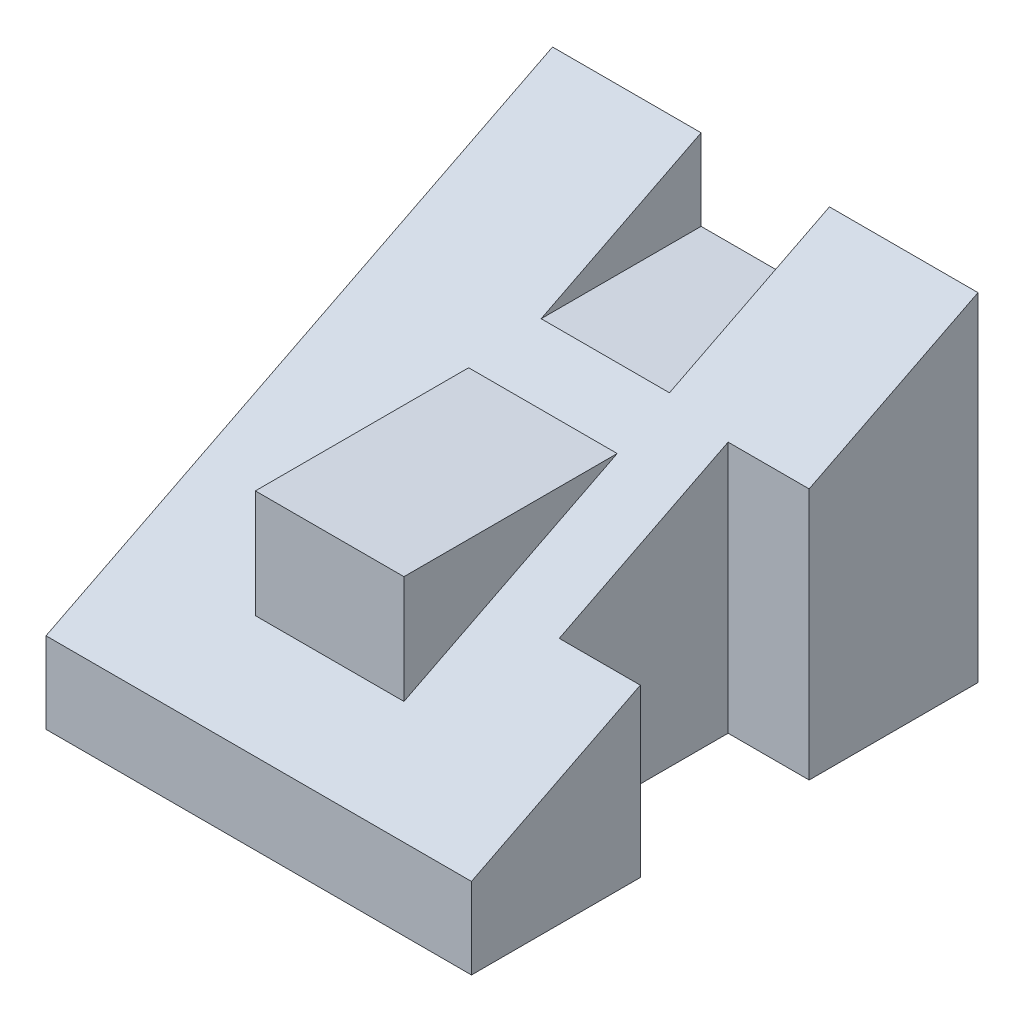
ISO-10303-21;
HEADER;
FILE_DESCRIPTION(('STEP AP214'),'2;1');
FILE_NAME('part.step','',(''),(''),'','','');
FILE_SCHEMA(('AUTOMOTIVE_DESIGN { 1 0 10303 214 1 1 1 1 }'));
ENDSEC;
DATA;
#1=APPLICATION_CONTEXT('core data for automotive mechanical design processes');
#2=APPLICATION_PROTOCOL_DEFINITION('international standard','automotive_design',2000,#1);
#3=PRODUCT_CONTEXT('',#1,'mechanical');
#4=PRODUCT('Part','Part','',(#3));
#5=PRODUCT_RELATED_PRODUCT_CATEGORY('part','',(#4));
#6=PRODUCT_DEFINITION_FORMATION('','',#4);
#7=PRODUCT_DEFINITION_CONTEXT('part definition',#1,'design');
#8=PRODUCT_DEFINITION('design','',#6,#7);
#9=PRODUCT_DEFINITION_SHAPE('','',#8);
#10=(LENGTH_UNIT() NAMED_UNIT(*) SI_UNIT(.MILLI.,.METRE.));
#11=(NAMED_UNIT(*) PLANE_ANGLE_UNIT() SI_UNIT($,.RADIAN.));
#12=(NAMED_UNIT(*) SI_UNIT($,.STERADIAN.) SOLID_ANGLE_UNIT());
#13=UNCERTAINTY_MEASURE_WITH_UNIT(LENGTH_MEASURE(1.E-05),#10,'distance_accuracy_value','');
#14=(GEOMETRIC_REPRESENTATION_CONTEXT(3) GLOBAL_UNCERTAINTY_ASSIGNED_CONTEXT((#13)) GLOBAL_UNIT_ASSIGNED_CONTEXT((#10,
#11,#12)) REPRESENTATION_CONTEXT('',''));
#15=CARTESIAN_POINT('',(0.,0.,0.));
#16=DIRECTION('',(0.,0.,1.));
#17=DIRECTION('',(1.,0.,0.));
#18=AXIS2_PLACEMENT_3D('',#15,#16,#17);
#19=CARTESIAN_POINT('',(63.,39.7863912858962,20.1584382515207));
#20=DIRECTION('',(0.,-0.892035776030268,-0.451964793188669));
#21=DIRECTION('',(0.,0.45196479318867,-0.892035776030269));
#22=AXIS2_PLACEMENT_3D('',#19,#20,#21);
#23=PLANE('',#22);
#24=DIRECTION('',(0.,-0.45196479318867,0.892035776030269));
#25=VECTOR('',#24,1.);
#26=CARTESIAN_POINT('',(0.,39.7863912858962,20.1584382515207));
#27=LINE('',#26,#25);
#28=CARTESIAN_POINT('',(0.,50.,0.));
#29=VERTEX_POINT('',#28);
#30=CARTESIAN_POINT('',(0.,12.,75.));
#31=VERTEX_POINT('',#30);
#32=EDGE_CURVE('E255',#29,#31,#27,.T.);
#33=ORIENTED_EDGE('',*,*,#32,.T.);
#34=DIRECTION('',(-1.,0.,0.));
#35=VECTOR('',#34,1.);
#36=CARTESIAN_POINT('',(63.,12.,75.));
#37=LINE('',#36,#35);
#38=CARTESIAN_POINT('',(63.,12.,75.));
#39=VERTEX_POINT('',#38);
#40=EDGE_CURVE('E54',#39,#31,#37,.T.);
#41=ORIENTED_EDGE('',*,*,#40,.F.);
#42=DIRECTION('',(0.,-0.45196479318867,0.892035776030269));
#43=VECTOR('',#42,1.);
#44=CARTESIAN_POINT('',(63.,39.7863912858962,20.1584382515207));
#45=LINE('',#44,#43);
#46=CARTESIAN_POINT('',(63.,24.6666666666667,50.));
#47=VERTEX_POINT('',#46);
#48=EDGE_CURVE('E260',#47,#39,#45,.T.);
#49=ORIENTED_EDGE('',*,*,#48,.F.);
#50=DIRECTION('',(-1.,0.,0.));
#51=VECTOR('',#50,1.);
#52=CARTESIAN_POINT('',(63.,24.6666666666667,50.));
#53=LINE('',#52,#51);
#54=CARTESIAN_POINT('',(51.,24.6666666666667,50.));
#55=VERTEX_POINT('',#54);
#56=EDGE_CURVE('E11',#47,#55,#53,.T.);
#57=ORIENTED_EDGE('',*,*,#56,.T.);
#58=DIRECTION('',(0.,-0.45196479318867,0.892035776030269));
#59=VECTOR('',#58,1.);
#60=CARTESIAN_POINT('',(51.,39.7863912858962,20.1584382515207));
#61=LINE('',#60,#59);
#62=CARTESIAN_POINT('',(51.,37.3333333333333,25.));
#63=VERTEX_POINT('',#62);
#64=EDGE_CURVE('E240',#63,#55,#61,.T.);
#65=ORIENTED_EDGE('',*,*,#64,.F.);
#66=DIRECTION('',(-1.,0.,0.));
#67=VECTOR('',#66,1.);
#68=CARTESIAN_POINT('',(63.,37.3333333333333,25.));
#69=LINE('',#68,#67);
#70=CARTESIAN_POINT('',(63.,37.3333333333333,25.));
#71=VERTEX_POINT('',#70);
#72=EDGE_CURVE('E234',#71,#63,#69,.T.);
#73=ORIENTED_EDGE('',*,*,#72,.F.);
#74=DIRECTION('',(0.,-0.45196479318867,0.892035776030269));
#75=VECTOR('',#74,1.);
#76=CARTESIAN_POINT('',(63.,39.7863912858962,20.1584382515207));
#77=LINE('',#76,#75);
#78=CARTESIAN_POINT('',(63.,50.,0.));
#79=VERTEX_POINT('',#78);
#80=EDGE_CURVE('E207',#79,#71,#77,.T.);
#81=ORIENTED_EDGE('',*,*,#80,.F.);
#82=DIRECTION('',(-1.,0.,0.));
#83=VECTOR('',#82,1.);
#84=CARTESIAN_POINT('',(63.,50.,0.));
#85=LINE('',#84,#83);
#86=CARTESIAN_POINT('',(41.,50.,0.));
#87=VERTEX_POINT('',#86);
#88=EDGE_CURVE('E187',#79,#87,#85,.T.);
#89=ORIENTED_EDGE('',*,*,#88,.T.);
#90=DIRECTION('',(0.,-0.45196479318867,0.892035776030269));
#91=VECTOR('',#90,1.);
#92=CARTESIAN_POINT('',(41.,39.7863912858962,20.1584382515207));
#93=LINE('',#92,#91);
#94=CARTESIAN_POINT('',(41.,38.,23.6842105263158));
#95=VERTEX_POINT('',#94);
#96=EDGE_CURVE('E171',#87,#95,#93,.T.);
#97=ORIENTED_EDGE('',*,*,#96,.T.);
#98=DIRECTION('',(-1.,0.,0.));
#99=VECTOR('',#98,1.);
#100=CARTESIAN_POINT('',(63.,38.,23.6842105263158));
#101=LINE('',#100,#99);
#102=CARTESIAN_POINT('',(22.,38.,23.6842105263158));
#103=VERTEX_POINT('',#102);
#104=EDGE_CURVE('E69',#95,#103,#101,.T.);
#105=ORIENTED_EDGE('',*,*,#104,.T.);
#106=DIRECTION('',(0.,-0.45196479318867,0.892035776030269));
#107=VECTOR('',#106,1.);
#108=CARTESIAN_POINT('',(22.,39.7863912858962,20.1584382515207));
#109=LINE('',#108,#107);
#110=CARTESIAN_POINT('',(22.,50.,0.));
#111=VERTEX_POINT('',#110);
#112=EDGE_CURVE('E191',#111,#103,#109,.T.);
#113=ORIENTED_EDGE('',*,*,#112,.F.);
#114=DIRECTION('',(-1.,0.,0.));
#115=VECTOR('',#114,1.);
#116=CARTESIAN_POINT('',(22.,50.,0.));
#117=LINE('',#116,#115);
#118=EDGE_CURVE('E202',#111,#29,#117,.T.);
#119=ORIENTED_EDGE('',*,*,#118,.T.);
#120=EDGE_LOOP('',(#33,#41,#49,#57,#65,#73,#81,#89,#97,#105,#113,#119));
#121=FACE_BOUND('',#120,.T.);
#122=DIRECTION('',(0.,-0.45196479318867,0.892035776030269));
#123=VECTOR('',#122,1.);
#124=CARTESIAN_POINT('',(19.,39.7863912858962,20.1584382515207));
#125=LINE('',#124,#123);
#126=CARTESIAN_POINT('',(19.,34.08,31.421052631579));
#127=VERTEX_POINT('',#126);
#128=CARTESIAN_POINT('',(19.,18.08,63.));
#129=VERTEX_POINT('',#128);
#130=EDGE_CURVE('E61',#127,#129,#125,.T.);
#131=ORIENTED_EDGE('',*,*,#130,.F.);
#132=DIRECTION('',(-1.,0.,0.));
#133=VECTOR('',#132,1.);
#134=CARTESIAN_POINT('',(41.,34.08,31.421052631579));
#135=LINE('',#134,#133);
#136=CARTESIAN_POINT('',(41.,34.08,31.421052631579));
#137=VERTEX_POINT('',#136);
#138=EDGE_CURVE('E178',#137,#127,#135,.T.);
#139=ORIENTED_EDGE('',*,*,#138,.F.);
#140=DIRECTION('',(0.,-0.45196479318867,0.892035776030269));
#141=VECTOR('',#140,1.);
#142=CARTESIAN_POINT('',(41.,39.7863912858962,20.1584382515207));
#143=LINE('',#142,#141);
#144=CARTESIAN_POINT('',(41.,18.08,63.));
#145=VERTEX_POINT('',#144);
#146=EDGE_CURVE('E160',#137,#145,#143,.T.);
#147=ORIENTED_EDGE('',*,*,#146,.T.);
#148=DIRECTION('',(-1.,0.,0.));
#149=VECTOR('',#148,1.);
#150=CARTESIAN_POINT('',(41.,18.08,63.));
#151=LINE('',#150,#149);
#152=EDGE_CURVE('E155',#145,#129,#151,.T.);
#153=ORIENTED_EDGE('',*,*,#152,.T.);
#154=EDGE_LOOP('',(#131,#139,#147,#153));
#155=FACE_BOUND('',#154,.T.);
#156=ADVANCED_FACE('F45',(#121,#155),#23,.F.);
#157=CARTESIAN_POINT('',(63.,38.,0.));
#158=DIRECTION('',(0.,1.,0.));
#159=DIRECTION('',(0.,0.,1.));
#160=AXIS2_PLACEMENT_3D('',#157,#158,#159);
#161=PLANE('',#160);
#162=ORIENTED_EDGE('',*,*,#104,.F.);
#163=DIRECTION('',(0.,0.,-1.));
#164=VECTOR('',#163,1.);
#165=CARTESIAN_POINT('',(41.,38.,0.));
#166=LINE('',#165,#164);
#167=CARTESIAN_POINT('',(41.,38.,0.));
#168=VERTEX_POINT('',#167);
#169=EDGE_CURVE('E176',#95,#168,#166,.T.);
#170=ORIENTED_EDGE('',*,*,#169,.T.);
#171=DIRECTION('',(-1.,0.,0.));
#172=VECTOR('',#171,1.);
#173=CARTESIAN_POINT('',(63.,38.,0.));
#174=LINE('',#173,#172);
#175=CARTESIAN_POINT('',(22.,38.,0.));
#176=VERTEX_POINT('',#175);
#177=EDGE_CURVE('E220',#168,#176,#174,.T.);
#178=ORIENTED_EDGE('',*,*,#177,.T.);
#179=DIRECTION('',(0.,0.,-1.));
#180=VECTOR('',#179,1.);
#181=CARTESIAN_POINT('',(22.,38.,0.));
#182=LINE('',#181,#180);
#183=EDGE_CURVE('E195',#103,#176,#182,.T.);
#184=ORIENTED_EDGE('',*,*,#183,.F.);
#185=EDGE_LOOP('',(#162,#170,#178,#184));
#186=FACE_BOUND('',#185,.T.);
#187=ADVANCED_FACE('F336',(#186),#161,.T.);
#188=CARTESIAN_POINT('',(63.,0.,50.));
#189=DIRECTION('',(0.,0.,-1.));
#190=DIRECTION('',(0.,1.,0.));
#191=AXIS2_PLACEMENT_3D('',#188,#189,#190);
#192=PLANE('',#191);
#193=DIRECTION('',(0.,-1.,0.));
#194=VECTOR('',#193,1.);
#195=CARTESIAN_POINT('',(51.,0.,50.));
#196=LINE('',#195,#194);
#197=CARTESIAN_POINT('',(51.,0.,50.));
#198=VERTEX_POINT('',#197);
#199=EDGE_CURVE('E244',#55,#198,#196,.T.);
#200=ORIENTED_EDGE('',*,*,#199,.F.);
#201=ORIENTED_EDGE('',*,*,#56,.F.);
#202=DIRECTION('',(0.,-1.,0.));
#203=VECTOR('',#202,1.);
#204=CARTESIAN_POINT('',(63.,0.,50.));
#205=LINE('',#204,#203);
#206=CARTESIAN_POINT('',(63.,0.,50.));
#207=VERTEX_POINT('',#206);
#208=EDGE_CURVE('E256',#47,#207,#205,.T.);
#209=ORIENTED_EDGE('',*,*,#208,.T.);
#210=DIRECTION('',(-1.,0.,0.));
#211=VECTOR('',#210,1.);
#212=CARTESIAN_POINT('',(63.,0.,50.));
#213=LINE('',#212,#211);
#214=EDGE_CURVE('E270',#207,#198,#213,.T.);
#215=ORIENTED_EDGE('',*,*,#214,.T.);
#216=EDGE_LOOP('',(#200,#201,#209,#215));
#217=FACE_BOUND('',#216,.T.);
#218=ADVANCED_FACE('F47',(#217),#192,.T.);
#219=CARTESIAN_POINT('',(63.,0.,75.));
#220=DIRECTION('',(0.,0.,-1.));
#221=DIRECTION('',(-1.,0.,0.));
#222=AXIS2_PLACEMENT_3D('',#219,#220,#221);
#223=PLANE('',#222);
#224=DIRECTION('',(0.,-1.,0.));
#225=VECTOR('',#224,1.);
#226=CARTESIAN_POINT('',(0.,0.,75.));
#227=LINE('',#226,#225);
#228=CARTESIAN_POINT('',(0.,0.,75.));
#229=VERTEX_POINT('',#228);
#230=EDGE_CURVE('E273',#31,#229,#227,.T.);
#231=ORIENTED_EDGE('',*,*,#230,.T.);
#232=DIRECTION('',(-1.,0.,0.));
#233=VECTOR('',#232,1.);
#234=CARTESIAN_POINT('',(63.,0.,75.));
#235=LINE('',#234,#233);
#236=CARTESIAN_POINT('',(63.,0.,75.));
#237=VERTEX_POINT('',#236);
#238=EDGE_CURVE('E280',#237,#229,#235,.T.);
#239=ORIENTED_EDGE('',*,*,#238,.F.);
#240=DIRECTION('',(0.,-1.,0.));
#241=VECTOR('',#240,1.);
#242=CARTESIAN_POINT('',(63.,0.,75.));
#243=LINE('',#242,#241);
#244=EDGE_CURVE('E264',#39,#237,#243,.T.);
#245=ORIENTED_EDGE('',*,*,#244,.F.);
#246=ORIENTED_EDGE('',*,*,#40,.T.);
#247=EDGE_LOOP('',(#231,#239,#245,#246));
#248=FACE_BOUND('',#247,.T.);
#249=ADVANCED_FACE('F289',(#248),#223,.F.);
#250=CARTESIAN_POINT('',(63.,0.,0.));
#251=DIRECTION('',(0.,1.,0.));
#252=DIRECTION('',(0.,0.,1.));
#253=AXIS2_PLACEMENT_3D('',#250,#251,#252);
#254=PLANE('',#253);
#255=DIRECTION('',(0.,0.,-1.));
#256=VECTOR('',#255,1.);
#257=CARTESIAN_POINT('',(0.,0.,0.));
#258=LINE('',#257,#256);
#259=CARTESIAN_POINT('',(0.,0.,0.));
#260=VERTEX_POINT('',#259);
#261=EDGE_CURVE('E261',#229,#260,#258,.T.);
#262=ORIENTED_EDGE('',*,*,#261,.T.);
#263=DIRECTION('',(-1.,0.,0.));
#264=VECTOR('',#263,1.);
#265=CARTESIAN_POINT('',(63.,0.,0.));
#266=LINE('',#265,#264);
#267=CARTESIAN_POINT('',(63.,0.,0.));
#268=VERTEX_POINT('',#267);
#269=EDGE_CURVE('E226',#268,#260,#266,.T.);
#270=ORIENTED_EDGE('',*,*,#269,.F.);
#271=DIRECTION('',(0.,0.,-1.));
#272=VECTOR('',#271,1.);
#273=CARTESIAN_POINT('',(63.,0.,0.));
#274=LINE('',#273,#272);
#275=CARTESIAN_POINT('',(63.,0.,25.));
#276=VERTEX_POINT('',#275);
#277=EDGE_CURVE('E213',#276,#268,#274,.T.);
#278=ORIENTED_EDGE('',*,*,#277,.F.);
#279=DIRECTION('',(-1.,0.,0.));
#280=VECTOR('',#279,1.);
#281=CARTESIAN_POINT('',(63.,0.,25.));
#282=LINE('',#281,#280);
#283=CARTESIAN_POINT('',(51.,0.,25.));
#284=VERTEX_POINT('',#283);
#285=EDGE_CURVE('E230',#276,#284,#282,.T.);
#286=ORIENTED_EDGE('',*,*,#285,.T.);
#287=DIRECTION('',(0.,0.,-1.));
#288=VECTOR('',#287,1.);
#289=CARTESIAN_POINT('',(51.,0.,0.));
#290=LINE('',#289,#288);
#291=EDGE_CURVE('E248',#198,#284,#290,.T.);
#292=ORIENTED_EDGE('',*,*,#291,.F.);
#293=ORIENTED_EDGE('',*,*,#214,.F.);
#294=DIRECTION('',(0.,0.,-1.));
#295=VECTOR('',#294,1.);
#296=CARTESIAN_POINT('',(63.,0.,0.));
#297=LINE('',#296,#295);
#298=EDGE_CURVE('E267',#237,#207,#297,.T.);
#299=ORIENTED_EDGE('',*,*,#298,.F.);
#300=ORIENTED_EDGE('',*,*,#238,.T.);
#301=EDGE_LOOP('',(#262,#270,#278,#286,#292,#293,#299,#300));
#302=FACE_BOUND('',#301,.T.);
#303=ADVANCED_FACE('F299',(#302),#254,.F.);
#304=CARTESIAN_POINT('',(63.,0.,0.));
#305=DIRECTION('',(1.,0.,0.));
#306=DIRECTION('',(0.,0.,-1.));
#307=AXIS2_PLACEMENT_3D('',#304,#305,#306);
#308=PLANE('',#307);
#309=ORIENTED_EDGE('',*,*,#208,.F.);
#310=ORIENTED_EDGE('',*,*,#48,.T.);
#311=ORIENTED_EDGE('',*,*,#244,.T.);
#312=ORIENTED_EDGE('',*,*,#298,.T.);
#313=EDGE_LOOP('',(#309,#310,#311,#312));
#314=FACE_BOUND('',#313,.T.);
#315=ADVANCED_FACE('F323',(#314),#308,.T.);
#316=CARTESIAN_POINT('',(0.,0.,0.));
#317=DIRECTION('',(1.,0.,0.));
#318=DIRECTION('',(0.,0.,-1.));
#319=AXIS2_PLACEMENT_3D('',#316,#317,#318);
#320=PLANE('',#319);
#321=ORIENTED_EDGE('',*,*,#32,.F.);
#322=DIRECTION('',(0.,1.,0.));
#323=VECTOR('',#322,1.);
#324=CARTESIAN_POINT('',(0.,0.,0.));
#325=LINE('',#324,#323);
#326=EDGE_CURVE('E206',#260,#29,#325,.T.);
#327=ORIENTED_EDGE('',*,*,#326,.F.);
#328=ORIENTED_EDGE('',*,*,#261,.F.);
#329=ORIENTED_EDGE('',*,*,#230,.F.);
#330=EDGE_LOOP('',(#321,#327,#328,#329));
#331=FACE_BOUND('',#330,.T.);
#332=ADVANCED_FACE('F295',(#331),#320,.F.);
#333=CARTESIAN_POINT('',(51.,0.,0.));
#334=DIRECTION('',(1.,0.,0.));
#335=DIRECTION('',(0.,0.,-1.));
#336=AXIS2_PLACEMENT_3D('',#333,#334,#335);
#337=PLANE('',#336);
#338=ORIENTED_EDGE('',*,*,#64,.T.);
#339=ORIENTED_EDGE('',*,*,#199,.T.);
#340=ORIENTED_EDGE('',*,*,#291,.T.);
#341=DIRECTION('',(0.,-1.,0.));
#342=VECTOR('',#341,1.);
#343=CARTESIAN_POINT('',(51.,0.,25.));
#344=LINE('',#343,#342);
#345=EDGE_CURVE('E251',#63,#284,#344,.T.);
#346=ORIENTED_EDGE('',*,*,#345,.F.);
#347=EDGE_LOOP('',(#338,#339,#340,#346));
#348=FACE_BOUND('',#347,.T.);
#349=ADVANCED_FACE('F318',(#348),#337,.T.);
#350=CARTESIAN_POINT('',(63.,0.,25.));
#351=DIRECTION('',(0.,0.,-1.));
#352=DIRECTION('',(-1.,0.,0.));
#353=AXIS2_PLACEMENT_3D('',#350,#351,#352);
#354=PLANE('',#353);
#355=ORIENTED_EDGE('',*,*,#72,.T.);
#356=ORIENTED_EDGE('',*,*,#345,.T.);
#357=ORIENTED_EDGE('',*,*,#285,.F.);
#358=DIRECTION('',(0.,-1.,0.));
#359=VECTOR('',#358,1.);
#360=CARTESIAN_POINT('',(63.,0.,25.));
#361=LINE('',#360,#359);
#362=EDGE_CURVE('E210',#71,#276,#361,.T.);
#363=ORIENTED_EDGE('',*,*,#362,.F.);
#364=EDGE_LOOP('',(#355,#356,#357,#363));
#365=FACE_BOUND('',#364,.T.);
#366=ADVANCED_FACE('F315',(#365),#354,.F.);
#367=CARTESIAN_POINT('',(63.,0.,0.));
#368=DIRECTION('',(0.,0.,1.));
#369=DIRECTION('',(1.,0.,0.));
#370=AXIS2_PLACEMENT_3D('',#367,#368,#369);
#371=PLANE('',#370);
#372=ORIENTED_EDGE('',*,*,#326,.T.);
#373=ORIENTED_EDGE('',*,*,#118,.F.);
#374=DIRECTION('',(0.,1.,0.));
#375=VECTOR('',#374,1.);
#376=CARTESIAN_POINT('',(22.,0.,0.));
#377=LINE('',#376,#375);
#378=EDGE_CURVE('E199',#176,#111,#377,.T.);
#379=ORIENTED_EDGE('',*,*,#378,.F.);
#380=ORIENTED_EDGE('',*,*,#177,.F.);
#381=DIRECTION('',(0.,1.,0.));
#382=VECTOR('',#381,1.);
#383=CARTESIAN_POINT('',(41.,0.,0.));
#384=LINE('',#383,#382);
#385=EDGE_CURVE('E184',#168,#87,#384,.T.);
#386=ORIENTED_EDGE('',*,*,#385,.T.);
#387=ORIENTED_EDGE('',*,*,#88,.F.);
#388=DIRECTION('',(0.,1.,0.));
#389=VECTOR('',#388,1.);
#390=CARTESIAN_POINT('',(63.,0.,0.));
#391=LINE('',#390,#389);
#392=EDGE_CURVE('E216',#268,#79,#391,.T.);
#393=ORIENTED_EDGE('',*,*,#392,.F.);
#394=ORIENTED_EDGE('',*,*,#269,.T.);
#395=EDGE_LOOP('',(#372,#373,#379,#380,#386,#387,#393,#394));
#396=FACE_BOUND('',#395,.T.);
#397=ADVANCED_FACE('F304',(#396),#371,.F.);
#398=CARTESIAN_POINT('',(63.,0.,0.));
#399=DIRECTION('',(1.,0.,0.));
#400=DIRECTION('',(0.,0.,-1.));
#401=AXIS2_PLACEMENT_3D('',#398,#399,#400);
#402=PLANE('',#401);
#403=ORIENTED_EDGE('',*,*,#392,.T.);
#404=ORIENTED_EDGE('',*,*,#80,.T.);
#405=ORIENTED_EDGE('',*,*,#362,.T.);
#406=ORIENTED_EDGE('',*,*,#277,.T.);
#407=EDGE_LOOP('',(#403,#404,#405,#406));
#408=FACE_BOUND('',#407,.T.);
#409=ADVANCED_FACE('F308',(#408),#402,.T.);
#410=CARTESIAN_POINT('',(22.,0.,0.));
#411=DIRECTION('',(1.,0.,0.));
#412=DIRECTION('',(0.,0.,-1.));
#413=AXIS2_PLACEMENT_3D('',#410,#411,#412);
#414=PLANE('',#413);
#415=ORIENTED_EDGE('',*,*,#112,.T.);
#416=ORIENTED_EDGE('',*,*,#183,.T.);
#417=ORIENTED_EDGE('',*,*,#378,.T.);
#418=EDGE_LOOP('',(#415,#416,#417));
#419=FACE_BOUND('',#418,.T.);
#420=ADVANCED_FACE('F379',(#419),#414,.T.);
#421=CARTESIAN_POINT('',(41.,0.,0.));
#422=DIRECTION('',(1.,0.,0.));
#423=DIRECTION('',(0.,0.,-1.));
#424=AXIS2_PLACEMENT_3D('',#421,#422,#423);
#425=PLANE('',#424);
#426=ORIENTED_EDGE('',*,*,#96,.F.);
#427=ORIENTED_EDGE('',*,*,#385,.F.);
#428=ORIENTED_EDGE('',*,*,#169,.F.);
#429=EDGE_LOOP('',(#426,#427,#428));
#430=FACE_BOUND('',#429,.T.);
#431=ADVANCED_FACE('F382',(#430),#425,.F.);
#432=CARTESIAN_POINT('',(41.,34.08,0.));
#433=DIRECTION('',(0.,-1.,0.));
#434=DIRECTION('',(0.,0.,-1.));
#435=AXIS2_PLACEMENT_3D('',#432,#433,#434);
#436=PLANE('',#435);
#437=DIRECTION('',(0.,0.,1.));
#438=VECTOR('',#437,1.);
#439=CARTESIAN_POINT('',(19.,34.08,0.));
#440=LINE('',#439,#438);
#441=CARTESIAN_POINT('',(19.,34.08,63.));
#442=VERTEX_POINT('',#441);
#443=EDGE_CURVE('E169',#127,#442,#440,.T.);
#444=ORIENTED_EDGE('',*,*,#443,.T.);
#445=DIRECTION('',(-1.,0.,0.));
#446=VECTOR('',#445,1.);
#447=CARTESIAN_POINT('',(41.,34.08,63.));
#448=LINE('',#447,#446);
#449=CARTESIAN_POINT('',(41.,34.08,63.));
#450=VERTEX_POINT('',#449);
#451=EDGE_CURVE('E152',#450,#442,#448,.T.);
#452=ORIENTED_EDGE('',*,*,#451,.F.);
#453=DIRECTION('',(0.,0.,1.));
#454=VECTOR('',#453,1.);
#455=CARTESIAN_POINT('',(41.,34.08,0.));
#456=LINE('',#455,#454);
#457=EDGE_CURVE('E161',#137,#450,#456,.T.);
#458=ORIENTED_EDGE('',*,*,#457,.F.);
#459=ORIENTED_EDGE('',*,*,#138,.T.);
#460=EDGE_LOOP('',(#444,#452,#458,#459));
#461=FACE_BOUND('',#460,.T.);
#462=ADVANCED_FACE('F168',(#461),#436,.F.);
#463=CARTESIAN_POINT('',(41.,0.,63.));
#464=DIRECTION('',(0.,0.,-1.));
#465=DIRECTION('',(0.,1.,0.));
#466=AXIS2_PLACEMENT_3D('',#463,#464,#465);
#467=PLANE('',#466);
#468=DIRECTION('',(0.,-1.,0.));
#469=VECTOR('',#468,1.);
#470=CARTESIAN_POINT('',(19.,0.,63.));
#471=LINE('',#470,#469);
#472=EDGE_CURVE('E461',#442,#129,#471,.T.);
#473=ORIENTED_EDGE('',*,*,#472,.T.);
#474=ORIENTED_EDGE('',*,*,#152,.F.);
#475=DIRECTION('',(0.,-1.,0.));
#476=VECTOR('',#475,1.);
#477=CARTESIAN_POINT('',(41.,0.,63.));
#478=LINE('',#477,#476);
#479=EDGE_CURVE('E148',#450,#145,#478,.T.);
#480=ORIENTED_EDGE('',*,*,#479,.F.);
#481=ORIENTED_EDGE('',*,*,#451,.T.);
#482=EDGE_LOOP('',(#473,#474,#480,#481));
#483=FACE_BOUND('',#482,.T.);
#484=ADVANCED_FACE('F150',(#483),#467,.F.);
#485=CARTESIAN_POINT('',(41.,0.,0.));
#486=DIRECTION('',(1.,0.,0.));
#487=DIRECTION('',(0.,0.,-1.));
#488=AXIS2_PLACEMENT_3D('',#485,#486,#487);
#489=PLANE('',#488);
#490=ORIENTED_EDGE('',*,*,#457,.T.);
#491=ORIENTED_EDGE('',*,*,#479,.T.);
#492=ORIENTED_EDGE('',*,*,#146,.F.);
#493=EDGE_LOOP('',(#490,#491,#492));
#494=FACE_BOUND('',#493,.T.);
#495=ADVANCED_FACE('F163',(#494),#489,.T.);
#496=CARTESIAN_POINT('',(19.,0.,0.));
#497=DIRECTION('',(1.,0.,0.));
#498=DIRECTION('',(0.,0.,-1.));
#499=AXIS2_PLACEMENT_3D('',#496,#497,#498);
#500=PLANE('',#499);
#501=ORIENTED_EDGE('',*,*,#443,.F.);
#502=ORIENTED_EDGE('',*,*,#130,.T.);
#503=ORIENTED_EDGE('',*,*,#472,.F.);
#504=EDGE_LOOP('',(#501,#502,#503));
#505=FACE_BOUND('',#504,.T.);
#506=ADVANCED_FACE('F450',(#505),#500,.F.);
#507=CLOSED_SHELL('',(#156,#187,#218,#249,#303,#315,#332,#349,#366,#397,#409,#420,#431,#462,
#484,#495,#506));
#508=MANIFOLD_SOLID_BREP('B2',#507);
#509=ADVANCED_BREP_SHAPE_REPRESENTATION('',(#18,#508),#14);
#510=SHAPE_DEFINITION_REPRESENTATION(#9,#509);
ENDSEC;
END-ISO-10303-21;
